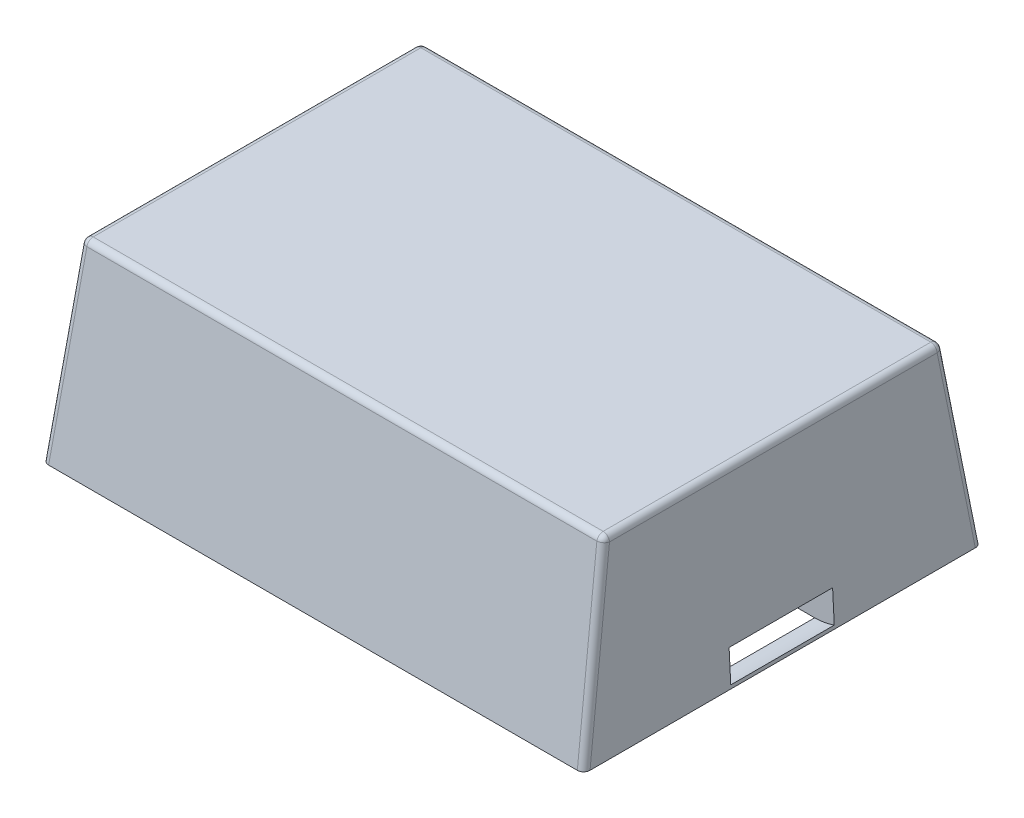
ISO-10303-21;
HEADER;
FILE_DESCRIPTION(('STEP AP214'),'2;1');
FILE_NAME('part.step','',(''),(''),'','','');
FILE_SCHEMA(('AUTOMOTIVE_DESIGN { 1 0 10303 214 1 1 1 1 }'));
ENDSEC;
DATA;
#1=APPLICATION_CONTEXT('core data for automotive mechanical design processes');
#2=APPLICATION_PROTOCOL_DEFINITION('international standard','automotive_design',2000,#1);
#3=PRODUCT_CONTEXT('',#1,'mechanical');
#4=PRODUCT('Part','Part','',(#3));
#5=PRODUCT_RELATED_PRODUCT_CATEGORY('part','',(#4));
#6=PRODUCT_DEFINITION_FORMATION('','',#4);
#7=PRODUCT_DEFINITION_CONTEXT('part definition',#1,'design');
#8=PRODUCT_DEFINITION('design','',#6,#7);
#9=PRODUCT_DEFINITION_SHAPE('','',#8);
#10=(LENGTH_UNIT() NAMED_UNIT(*) SI_UNIT(.MILLI.,.METRE.));
#11=(NAMED_UNIT(*) PLANE_ANGLE_UNIT() SI_UNIT($,.RADIAN.));
#12=(NAMED_UNIT(*) SI_UNIT($,.STERADIAN.) SOLID_ANGLE_UNIT());
#13=UNCERTAINTY_MEASURE_WITH_UNIT(LENGTH_MEASURE(1.E-05),#10,'distance_accuracy_value','');
#14=(GEOMETRIC_REPRESENTATION_CONTEXT(3) GLOBAL_UNCERTAINTY_ASSIGNED_CONTEXT((#13)) GLOBAL_UNIT_ASSIGNED_CONTEXT((#10,
#11,#12)) REPRESENTATION_CONTEXT('',''));
#15=CARTESIAN_POINT('',(0.,0.,0.));
#16=DIRECTION('',(0.,0.,1.));
#17=DIRECTION('',(1.,0.,0.));
#18=AXIS2_PLACEMENT_3D('',#15,#16,#17);
#19=CARTESIAN_POINT('',(0.,0.58,0.));
#20=DIRECTION('',(0.,-1.,0.));
#21=DIRECTION('',(0.,0.,-1.));
#22=AXIS2_PLACEMENT_3D('',#19,#20,#21);
#23=PLANE('',#22);
#24=DIRECTION('',(0.,0.,1.));
#25=VECTOR('',#24,1.);
#26=CARTESIAN_POINT('',(1.650624196682,0.58,0.));
#27=LINE('',#26,#25);
#28=CARTESIAN_POINT('',(1.650624196682,0.58,-1.139435416133));
#29=VERTEX_POINT('',#28);
#30=CARTESIAN_POINT('',(1.650624196682,0.58,-0.110564583867));
#31=VERTEX_POINT('',#30);
#32=EDGE_CURVE('E287',#29,#31,#27,.T.);
#33=ORIENTED_EDGE('',*,*,#32,.F.);
#34=DIRECTION('',(1.,0.,0.));
#35=VECTOR('',#34,1.);
#36=CARTESIAN_POINT('',(0.,0.58,-1.139435416133));
#37=LINE('',#36,#35);
#38=CARTESIAN_POINT('',(0.04937580331846,0.58,-1.139435416133));
#39=VERTEX_POINT('',#38);
#40=EDGE_CURVE('E364',#39,#29,#37,.T.);
#41=ORIENTED_EDGE('',*,*,#40,.F.);
#42=DIRECTION('',(0.,0.,-1.));
#43=VECTOR('',#42,1.);
#44=CARTESIAN_POINT('',(0.04937580331846,0.58,0.));
#45=LINE('',#44,#43);
#46=CARTESIAN_POINT('',(0.04937580331846,0.58,-0.110564583867));
#47=VERTEX_POINT('',#46);
#48=EDGE_CURVE('E192',#47,#39,#45,.T.);
#49=ORIENTED_EDGE('',*,*,#48,.F.);
#50=DIRECTION('',(1.,0.,0.));
#51=VECTOR('',#50,1.);
#52=CARTESIAN_POINT('',(1.7,0.58,-0.110564583867));
#53=LINE('',#52,#51);
#54=EDGE_CURVE('E357',#31,#47,#53,.F.);
#55=ORIENTED_EDGE('',*,*,#54,.F.);
#56=EDGE_LOOP('',(#33,#41,#49,#55));
#57=FACE_BOUND('',#56,.T.);
#58=ADVANCED_FACE('F17',(#57),#23,.F.);
#59=CARTESIAN_POINT('',(0.04937580331846,0.56,-1.139435416133));
#60=DIRECTION('',(1.,0.,0.));
#61=DIRECTION('',(0.,0.,-1.));
#62=AXIS2_PLACEMENT_3D('',#59,#60,#61);
#63=SPHERICAL_SURFACE('',#62,0.02);
#64=CARTESIAN_POINT('',(0.04937580331846,0.56,-1.139435416133));
#65=DIRECTION('',(0.,0.,-1.));
#66=DIRECTION('',(-1.,0.,0.));
#67=AXIS2_PLACEMENT_3D('',#64,#65,#66);
#68=CIRCLE('',#67,0.02);
#69=CARTESIAN_POINT('',(0.0294032126233718,0.561046719125,-1.139435416133));
#70=VERTEX_POINT('',#69);
#71=EDGE_CURVE('E184',#39,#70,#68,.F.);
#72=ORIENTED_EDGE('',*,*,#71,.F.);
#73=CARTESIAN_POINT('',(0.04937580331846,0.56,-1.139435416133));
#74=DIRECTION('',(1.,0.,0.));
#75=DIRECTION('',(0.,0.,-1.));
#76=AXIS2_PLACEMENT_3D('',#73,#74,#75);
#77=CIRCLE('',#76,0.02);
#78=CARTESIAN_POINT('',(0.0493758033184768,0.563184085911291,-1.15918032932377));
#79=VERTEX_POINT('',#78);
#80=EDGE_CURVE('E186',#79,#39,#77,.T.);
#81=ORIENTED_EDGE('',*,*,#80,.F.);
#82=CARTESIAN_POINT('',(0.0493758033184716,0.560000000000125,-1.1394354161329));
#83=DIRECTION('',(0.0516702392480006,0.985926897778821,0.158991630635971));
#84=DIRECTION('',(0.,-0.159204295573432,0.987245659535137));
#85=AXIS2_PLACEMENT_3D('',#82,#83,#84);
#86=CIRCLE('',#85,0.02);
#87=EDGE_CURVE('E20',#70,#79,#86,.F.);
#88=ORIENTED_EDGE('',*,*,#87,.F.);
#89=EDGE_LOOP('',(#72,#81,#88));
#90=FACE_BOUND('',#89,.T.);
#91=ADVANCED_FACE('F183',(#90),#63,.T.);
#92=CARTESIAN_POINT('',(0.003567106827442,0.156322923666,-1.2045328151));
#93=DIRECTION('',(0.904210336759122,-0.421640204614057,-0.0679941523292292));
#94=DIRECTION('',(0.422618261741002,0.906307787036509,0.));
#95=AXIS2_PLACEMENT_3D('',#92,#93,#94);
#96=CYLINDRICAL_SURFACE('',#95,0.02);
#97=CARTESIAN_POINT('',(0.0276318855562741,0.145101333052901,-1.20634242085651));
#98=DIRECTION('',(0.858265018656055,0.506661126287821,0.0817047174897378));
#99=DIRECTION('',(0.513206739775815,-0.847318414399055,-0.136639477710327));
#100=AXIS2_PLACEMENT_3D('',#97,#98,#99);
#101=ELLIPSE('',#100,0.0359151567758046,0.02);
#102=CARTESIAN_POINT('',(0.0276318855559927,0.148285418964822,-1.22608733404701));
#103=VERTEX_POINT('',#102);
#104=CARTESIAN_POINT('',(0.00939286155883296,0.175673887999902,-1.20433530115014));
#105=VERTEX_POINT('',#104);
#106=EDGE_CURVE('E191',#103,#105,#101,.T.);
#107=ORIENTED_EDGE('',*,*,#106,.F.);
#108=DIRECTION('',(0.904210336759015,-0.421640204614275,-0.0679941523293093));
#109=VECTOR('',#108,1.);
#110=CARTESIAN_POINT('',(-0.0499999999999999,0.184485761716962,-1.22024962788777));
#111=LINE('',#110,#109);
#112=CARTESIAN_POINT('',(-0.05,0.184485761716644,-1.22024962788798));
#113=VERTEX_POINT('',#112);
#114=EDGE_CURVE('E446',#113,#103,#111,.T.);
#115=ORIENTED_EDGE('',*,*,#114,.F.);
#116=CARTESIAN_POINT('',(-0.05,0.181301675804865,-1.20050471469748));
#117=DIRECTION('',(1.,0.,0.));
#118=DIRECTION('',(0.,-0.987245659535217,-0.159204295572932));
#119=AXIS2_PLACEMENT_3D('',#116,#117,#118);
#120=ELLIPSE('',#119,0.0221187473610224,0.02);
#121=CARTESIAN_POINT('',(-0.0500000000000298,0.203369234184495,-1.19986911987404));
#122=VERTEX_POINT('',#121);
#123=EDGE_CURVE('E403',#113,#122,#120,.T.);
#124=ORIENTED_EDGE('',*,*,#123,.T.);
#125=DIRECTION('',(-0.904210336759756,0.421640204614121,0.06799415232041));
#126=VECTOR('',#125,1.);
#127=CARTESIAN_POINT('',(0.00939286155909428,0.175673887999934,-1.20433530115));
#128=LINE('',#127,#126);
#129=EDGE_CURVE('E414',#122,#105,#128,.F.);
#130=ORIENTED_EDGE('',*,*,#129,.T.);
#131=EDGE_LOOP('',(#107,#115,#124,#130));
#132=FACE_BOUND('',#131,.T.);
#133=ADVANCED_FACE('F343',(#132),#96,.T.);
#134=CARTESIAN_POINT('',(0.,0.56,-1.139435416133));
#135=DIRECTION('',(1.,0.,0.));
#136=DIRECTION('',(0.,0.,-1.));
#137=AXIS2_PLACEMENT_3D('',#134,#135,#136);
#138=CYLINDRICAL_SURFACE('',#137,0.02);
#139=CARTESIAN_POINT('',(1.650624196682,0.56,-1.139435416133));
#140=DIRECTION('',(1.,0.,0.));
#141=DIRECTION('',(0.,0.,-1.));
#142=AXIS2_PLACEMENT_3D('',#139,#140,#141);
#143=CIRCLE('',#142,0.0200000000000001);
#144=CARTESIAN_POINT('',(1.65062419668184,0.563184085910978,-1.15918032932386));
#145=VERTEX_POINT('',#144);
#146=EDGE_CURVE('E298',#145,#29,#143,.T.);
#147=ORIENTED_EDGE('',*,*,#146,.F.);
#148=DIRECTION('',(1.,0.,0.));
#149=VECTOR('',#148,1.);
#150=CARTESIAN_POINT('',(1.7,0.56318408591099,-1.15918032932394));
#151=LINE('',#150,#149);
#152=EDGE_CURVE('E398',#79,#145,#151,.T.);
#153=ORIENTED_EDGE('',*,*,#152,.F.);
#154=ORIENTED_EDGE('',*,*,#80,.T.);
#155=ORIENTED_EDGE('',*,*,#40,.T.);
#156=EDGE_LOOP('',(#147,#153,#154,#155));
#157=FACE_BOUND('',#156,.T.);
#158=ADVANCED_FACE('F339',(#157),#138,.T.);
#159=CARTESIAN_POINT('',(1.650624196682,0.56,-1.139435416133));
#160=DIRECTION('',(1.,0.,0.));
#161=DIRECTION('',(0.,0.,-1.));
#162=AXIS2_PLACEMENT_3D('',#159,#160,#161);
#163=SPHERICAL_SURFACE('',#162,0.02);
#164=ORIENTED_EDGE('',*,*,#146,.T.);
#165=CARTESIAN_POINT('',(1.650624196682,0.56,-1.139435416133));
#166=DIRECTION('',(0.,0.,1.));
#167=DIRECTION('',(1.,0.,0.));
#168=AXIS2_PLACEMENT_3D('',#165,#166,#167);
#169=CIRCLE('',#168,0.02);
#170=CARTESIAN_POINT('',(1.67059678737688,0.561046719124671,-1.13943541613305));
#171=VERTEX_POINT('',#170);
#172=EDGE_CURVE('E295',#171,#29,#169,.T.);
#173=ORIENTED_EDGE('',*,*,#172,.F.);
#174=CARTESIAN_POINT('',(1.65062419668168,0.559999999999499,-1.1394354161332));
#175=DIRECTION('',(0.0516702392480006,-0.985926897778821,-0.158991630635971));
#176=DIRECTION('',(0.,0.159204295573432,-0.987245659535137));
#177=AXIS2_PLACEMENT_3D('',#174,#175,#176);
#178=CIRCLE('',#177,0.02);
#179=EDGE_CURVE('E305',#145,#171,#178,.T.);
#180=ORIENTED_EDGE('',*,*,#179,.F.);
#181=EDGE_LOOP('',(#164,#173,#180));
#182=FACE_BOUND('',#181,.T.);
#183=ADVANCED_FACE('F335',(#182),#163,.T.);
#184=CARTESIAN_POINT('',(1.694235144279,0.11,-0.4625));
#185=DIRECTION('',(0.,-1.,0.));
#186=DIRECTION('',(0.,0.,-1.));
#187=AXIS2_PLACEMENT_3D('',#184,#185,#186);
#188=PLANE('',#187);
#189=DIRECTION('',(1.,0.,0.));
#190=VECTOR('',#189,1.);
#191=CARTESIAN_POINT('',(1.924235144279,0.11,-0.462499999999998));
#192=LINE('',#191,#190);
#193=CARTESIAN_POINT('',(1.69423514427891,0.109999999999995,-0.4625));
#194=VERTEX_POINT('',#193);
#195=CARTESIAN_POINT('',(1.50230211742,0.11,-0.4625));
#196=VERTEX_POINT('',#195);
#197=EDGE_CURVE('E326',#194,#196,#192,.F.);
#198=ORIENTED_EDGE('',*,*,#197,.T.);
#199=DIRECTION('',(0.,0.,-1.));
#200=VECTOR('',#199,1.);
#201=CARTESIAN_POINT('',(1.50230211742,0.11,-0.4625));
#202=LINE('',#201,#200);
#203=CARTESIAN_POINT('',(1.50230211742,0.11,-0.7875));
#204=VERTEX_POINT('',#203);
#205=EDGE_CURVE('E475',#204,#196,#202,.F.);
#206=ORIENTED_EDGE('',*,*,#205,.F.);
#207=DIRECTION('',(1.,0.,0.));
#208=VECTOR('',#207,1.);
#209=CARTESIAN_POINT('',(1.924235144279,0.11,-0.787499999999998));
#210=LINE('',#209,#208);
#211=CARTESIAN_POINT('',(1.69423514427887,0.109999999999995,-0.7875));
#212=VERTEX_POINT('',#211);
#213=EDGE_CURVE('E312',#212,#204,#210,.F.);
#214=ORIENTED_EDGE('',*,*,#213,.F.);
#215=DIRECTION('',(0.,0.,1.));
#216=VECTOR('',#215,1.);
#217=CARTESIAN_POINT('',(1.69423514427887,0.109999999999993,0.));
#218=LINE('',#217,#216);
#219=EDGE_CURVE('E309',#194,#212,#218,.F.);
#220=ORIENTED_EDGE('',*,*,#219,.F.);
#221=EDGE_LOOP('',(#198,#206,#214,#220));
#222=FACE_BOUND('',#221,.T.);
#223=ADVANCED_FACE('F338',(#222),#188,.T.);
#224=CARTESIAN_POINT('',(1.650624196682,0.56,0.));
#225=DIRECTION('',(0.,0.,1.));
#226=DIRECTION('',(1.,0.,0.));
#227=AXIS2_PLACEMENT_3D('',#224,#225,#226);
#228=CYLINDRICAL_SURFACE('',#227,0.02);
#229=ORIENTED_EDGE('',*,*,#172,.T.);
#230=ORIENTED_EDGE('',*,*,#32,.T.);
#231=CARTESIAN_POINT('',(1.650624196682,0.56,-0.110564583867));
#232=DIRECTION('',(0.,0.,1.));
#233=DIRECTION('',(1.,0.,0.));
#234=AXIS2_PLACEMENT_3D('',#231,#232,#233);
#235=CIRCLE('',#234,0.02);
#236=CARTESIAN_POINT('',(1.67059678737686,0.561046719124993,-0.110564583867));
#237=VERTEX_POINT('',#236);
#238=EDGE_CURVE('E283',#237,#31,#235,.T.);
#239=ORIENTED_EDGE('',*,*,#238,.F.);
#240=DIRECTION('',(0.,0.,1.));
#241=VECTOR('',#240,1.);
#242=CARTESIAN_POINT('',(1.67059678737664,0.561046719124981,0.));
#243=LINE('',#242,#241);
#244=EDGE_CURVE('E290',#171,#237,#243,.T.);
#245=ORIENTED_EDGE('',*,*,#244,.F.);
#246=EDGE_LOOP('',(#229,#230,#239,#245));
#247=FACE_BOUND('',#246,.T.);
#248=ADVANCED_FACE('F275',(#247),#228,.T.);
#249=CARTESIAN_POINT('',(1.650624196682,0.56,-0.110564583867));
#250=DIRECTION('',(1.,0.,0.));
#251=DIRECTION('',(0.,0.,-1.));
#252=AXIS2_PLACEMENT_3D('',#249,#250,#251);
#253=SPHERICAL_SURFACE('',#252,0.02);
#254=CARTESIAN_POINT('',(1.65062419668165,0.560000000000143,-0.110564583866901));
#255=DIRECTION('',(-0.0516702392480006,0.985926897778821,-0.158991630635971));
#256=DIRECTION('',(0.,0.159204295573432,0.987245659535137));
#257=AXIS2_PLACEMENT_3D('',#254,#255,#256);
#258=CIRCLE('',#257,0.02);
#259=CARTESIAN_POINT('',(1.65062419668182,0.563184085911303,-0.0908196706762096));
#260=VERTEX_POINT('',#259);
#261=EDGE_CURVE('E390',#237,#260,#258,.F.);
#262=ORIENTED_EDGE('',*,*,#261,.F.);
#263=ORIENTED_EDGE('',*,*,#238,.T.);
#264=CARTESIAN_POINT('',(1.650624196682,0.56,-0.110564583867));
#265=DIRECTION('',(1.,0.,0.));
#266=DIRECTION('',(0.,0.,-1.));
#267=AXIS2_PLACEMENT_3D('',#264,#265,#266);
#268=CIRCLE('',#267,0.02);
#269=EDGE_CURVE('E286',#260,#31,#268,.F.);
#270=ORIENTED_EDGE('',*,*,#269,.F.);
#271=EDGE_LOOP('',(#262,#263,#270));
#272=FACE_BOUND('',#271,.T.);
#273=ADVANCED_FACE('F270',(#272),#253,.T.);
#274=CARTESIAN_POINT('',(1.7,0.56,-0.110564583867));
#275=DIRECTION('',(1.,0.,0.));
#276=DIRECTION('',(0.,0.,-1.));
#277=AXIS2_PLACEMENT_3D('',#274,#275,#276);
#278=CYLINDRICAL_SURFACE('',#277,0.02);
#279=ORIENTED_EDGE('',*,*,#269,.T.);
#280=ORIENTED_EDGE('',*,*,#54,.T.);
#281=CARTESIAN_POINT('',(0.04937580331846,0.56,-0.110564583867));
#282=DIRECTION('',(1.,0.,0.));
#283=DIRECTION('',(0.,0.,-1.));
#284=AXIS2_PLACEMENT_3D('',#281,#282,#283);
#285=CIRCLE('',#284,0.02);
#286=CARTESIAN_POINT('',(0.0493758033184453,0.563184085910998,-0.0908196706761992));
#287=VERTEX_POINT('',#286);
#288=EDGE_CURVE('E203',#287,#47,#285,.F.);
#289=ORIENTED_EDGE('',*,*,#288,.F.);
#290=DIRECTION('',(1.,0.,0.));
#291=VECTOR('',#290,1.);
#292=CARTESIAN_POINT('',(1.7,0.563184085911012,-0.0908196706761037));
#293=LINE('',#292,#291);
#294=EDGE_CURVE('E389',#260,#287,#293,.F.);
#295=ORIENTED_EDGE('',*,*,#294,.F.);
#296=EDGE_LOOP('',(#279,#280,#289,#295));
#297=FACE_BOUND('',#296,.T.);
#298=ADVANCED_FACE('F265',(#297),#278,.T.);
#299=CARTESIAN_POINT('',(0.04937580331846,0.56,-0.110564583867));
#300=DIRECTION('',(1.,0.,0.));
#301=DIRECTION('',(0.,0.,-1.));
#302=AXIS2_PLACEMENT_3D('',#299,#300,#301);
#303=SPHERICAL_SURFACE('',#302,0.02);
#304=CARTESIAN_POINT('',(0.0493758033184395,0.559999999999514,-0.110564583866997));
#305=DIRECTION('',(-0.0516702392480006,-0.985926897778821,0.158991630635971));
#306=DIRECTION('',(0.,-0.159204295573432,-0.987245659535137));
#307=AXIS2_PLACEMENT_3D('',#304,#305,#306);
#308=CIRCLE('',#307,0.02);
#309=CARTESIAN_POINT('',(0.0294032126233541,0.561046719124686,-0.110564583867));
#310=VERTEX_POINT('',#309);
#311=EDGE_CURVE('E231',#287,#310,#308,.T.);
#312=ORIENTED_EDGE('',*,*,#311,.F.);
#313=ORIENTED_EDGE('',*,*,#288,.T.);
#314=CARTESIAN_POINT('',(0.04937580331846,0.56,-0.110564583867));
#315=DIRECTION('',(0.,0.,-1.));
#316=DIRECTION('',(-1.,0.,0.));
#317=AXIS2_PLACEMENT_3D('',#314,#315,#316);
#318=CIRCLE('',#317,0.02);
#319=EDGE_CURVE('E202',#310,#47,#318,.T.);
#320=ORIENTED_EDGE('',*,*,#319,.F.);
#321=EDGE_LOOP('',(#312,#313,#320));
#322=FACE_BOUND('',#321,.T.);
#323=ADVANCED_FACE('F260',(#322),#303,.T.);
#324=CARTESIAN_POINT('',(0.005764855721132,0.11,-0.7875));
#325=DIRECTION('',(0.,-1.,0.));
#326=DIRECTION('',(0.,0.,-1.));
#327=AXIS2_PLACEMENT_3D('',#324,#325,#326);
#328=PLANE('',#327);
#329=DIRECTION('',(1.,0.,0.));
#330=VECTOR('',#329,1.);
#331=CARTESIAN_POINT('',(-0.224235144279,0.11,-0.787499999999998));
#332=LINE('',#331,#330);
#333=CARTESIAN_POINT('',(0.00576485572113177,0.11,-0.787499999999999));
#334=VERTEX_POINT('',#333);
#335=CARTESIAN_POINT('',(0.19769788258,0.11,-0.787499999999999));
#336=VERTEX_POINT('',#335);
#337=EDGE_CURVE('E251',#334,#336,#332,.T.);
#338=ORIENTED_EDGE('',*,*,#337,.T.);
#339=DIRECTION('',(0.,0.,1.));
#340=VECTOR('',#339,1.);
#341=CARTESIAN_POINT('',(0.19769788258,0.11,-0.7875));
#342=LINE('',#341,#340);
#343=CARTESIAN_POINT('',(0.19769788258,0.11,-0.462499999999999));
#344=VERTEX_POINT('',#343);
#345=EDGE_CURVE('E502',#344,#336,#342,.F.);
#346=ORIENTED_EDGE('',*,*,#345,.F.);
#347=DIRECTION('',(1.,0.,0.));
#348=VECTOR('',#347,1.);
#349=CARTESIAN_POINT('',(-0.224235144279,0.11,-0.462499999999998));
#350=LINE('',#349,#348);
#351=CARTESIAN_POINT('',(0.00576485572113165,0.11,-0.462499999999999));
#352=VERTEX_POINT('',#351);
#353=EDGE_CURVE('E237',#352,#344,#350,.T.);
#354=ORIENTED_EDGE('',*,*,#353,.F.);
#355=DIRECTION('',(0.,0.,1.));
#356=VECTOR('',#355,1.);
#357=CARTESIAN_POINT('',(0.00576485572113165,0.11,0.));
#358=LINE('',#357,#356);
#359=EDGE_CURVE('E234',#334,#352,#358,.T.);
#360=ORIENTED_EDGE('',*,*,#359,.F.);
#361=EDGE_LOOP('',(#338,#346,#354,#360));
#362=FACE_BOUND('',#361,.T.);
#363=ADVANCED_FACE('F264',(#362),#328,.T.);
#364=CARTESIAN_POINT('',(0.04937580331846,0.56,0.));
#365=DIRECTION('',(0.,0.,-1.));
#366=DIRECTION('',(-1.,0.,0.));
#367=AXIS2_PLACEMENT_3D('',#364,#365,#366);
#368=CYLINDRICAL_SURFACE('',#367,0.02);
#369=ORIENTED_EDGE('',*,*,#319,.T.);
#370=ORIENTED_EDGE('',*,*,#48,.T.);
#371=ORIENTED_EDGE('',*,*,#71,.T.);
#372=DIRECTION('',(0.,0.,1.));
#373=VECTOR('',#372,1.);
#374=CARTESIAN_POINT('',(0.0294032126233627,0.561046719125001,0.));
#375=LINE('',#374,#373);
#376=EDGE_CURVE('E199',#310,#70,#375,.F.);
#377=ORIENTED_EDGE('',*,*,#376,.F.);
#378=EDGE_LOOP('',(#369,#370,#371,#377));
#379=FACE_BOUND('',#378,.T.);
#380=ADVANCED_FACE('F197',(#379),#368,.T.);
#381=CARTESIAN_POINT('',(0.05466159413484,0.66085889707,-1.123170802047));
#382=DIRECTION('',(0.0516702392480006,0.985926897778821,0.158991630635971));
#383=DIRECTION('',(0.,-0.159204295573432,0.987245659535137));
#384=AXIS2_PLACEMENT_3D('',#381,#382,#383);
#385=CYLINDRICAL_SURFACE('',#384,0.02);
#386=DIRECTION('',(0.0516702392480959,0.98592689777888,0.158991630635571));
#387=VECTOR('',#386,1.);
#388=CARTESIAN_POINT('',(0.0276318855562899,0.148285418964997,-1.22608733404698));
#389=LINE('',#388,#387);
#390=EDGE_CURVE('E418',#103,#79,#389,.T.);
#391=ORIENTED_EDGE('',*,*,#390,.F.);
#392=ORIENTED_EDGE('',*,*,#106,.T.);
#393=CARTESIAN_POINT('',(0.0287608084982928,0.166642466019443,-1.20286867461427));
#394=DIRECTION('',(-0.422618261740812,-0.906307787036597,0.));
#395=DIRECTION('',(-0.832629915250704,0.388261705890477,0.394943378180496));
#396=AXIS2_PLACEMENT_3D('',#393,#394,#395);
#397=ELLIPSE('',#396,0.0218486106976755,0.02);
#398=CARTESIAN_POINT('',(0.00921111978072266,0.175758635582996,-1.20156738636809));
#399=VERTEX_POINT('',#398);
#400=EDGE_CURVE('E209',#105,#399,#397,.F.);
#401=ORIENTED_EDGE('',*,*,#400,.T.);
#402=DIRECTION('',(-0.051670239247986,-0.985926897778932,-0.158991630635285));
#403=VECTOR('',#402,1.);
#404=CARTESIAN_POINT('',(0.0294032126233627,0.561046719125001,-1.139435416133));
#405=LINE('',#404,#403);
#406=EDGE_CURVE('E206',#70,#399,#405,.T.);
#407=ORIENTED_EDGE('',*,*,#406,.F.);
#408=ORIENTED_EDGE('',*,*,#87,.T.);
#409=EDGE_LOOP('',(#391,#392,#401,#407,#408));
#410=FACE_BOUND('',#409,.T.);
#411=ADVANCED_FACE('F207',(#410),#385,.T.);
#412=CARTESIAN_POINT('',(0.009211119780713,0.175758635583,-1.25));
#413=DIRECTION('',(-0.422618261740812,-0.906307787036597,0.));
#414=DIRECTION('',(0.906307787036597,-0.422618261740812,0.));
#415=AXIS2_PLACEMENT_3D('',#412,#413,#414);
#416=PLANE('',#415);
#417=DIRECTION('',(0.,0.,-1.));
#418=VECTOR('',#417,1.);
#419=CARTESIAN_POINT('',(-0.05,0.203369234185,-1.25));
#420=LINE('',#419,#418);
#421=CARTESIAN_POINT('',(-0.0500000000000664,0.203369234184511,-0.917895186556306));
#422=VERTEX_POINT('',#421);
#423=EDGE_CURVE('E402',#122,#422,#420,.F.);
#424=ORIENTED_EDGE('',*,*,#423,.T.);
#425=DIRECTION('',(-0.905090049263908,0.422050421291957,-0.0518212756571847));
#426=VECTOR('',#425,1.);
#427=CARTESIAN_POINT('',(-0.00652457420968582,0.183096310196719,-0.915405984486533));
#428=LINE('',#427,#426);
#429=CARTESIAN_POINT('',(0.00921111978066979,0.175758635582726,-0.914505031330729));
#430=VERTEX_POINT('',#429);
#431=EDGE_CURVE('E253',#430,#422,#428,.T.);
#432=ORIENTED_EDGE('',*,*,#431,.F.);
#433=DIRECTION('',(0.,0.,1.));
#434=VECTOR('',#433,1.);
#435=CARTESIAN_POINT('',(0.00921111978071772,0.175758635583,0.));
#436=LINE('',#435,#434);
#437=EDGE_CURVE('E212',#399,#430,#436,.T.);
#438=ORIENTED_EDGE('',*,*,#437,.F.);
#439=ORIENTED_EDGE('',*,*,#400,.F.);
#440=ORIENTED_EDGE('',*,*,#129,.F.);
#441=EDGE_LOOP('',(#424,#432,#438,#439,#440));
#442=FACE_BOUND('',#441,.T.);
#443=ADVANCED_FACE('F424',(#442),#416,.F.);
#444=CARTESIAN_POINT('',(-0.01497693944453,0.164970154456,-0.915405984486));
#445=DIRECTION('',(-0.905090049263908,0.422050421291957,-0.0518212756571847));
#446=DIRECTION('',(-0.422618261740956,-0.90630778703653,0.));
#447=AXIS2_PLACEMENT_3D('',#444,#445,#446);
#448=CYLINDRICAL_SURFACE('',#447,0.02);
#449=CARTESIAN_POINT('',(0.00808219683871256,0.154217502616676,-0.914085724851368));
#450=DIRECTION('',(-0.998629534754575,0.0523359562429177,0.));
#451=DIRECTION('',(0.0518409533952964,0.989184317758293,-0.137211154984307));
#452=AXIS2_PLACEMENT_3D('',#449,#450,#451);
#453=ELLIPSE('',#452,0.0215997167723416,0.02);
#454=CARTESIAN_POINT('',(0.00820688765890961,0.156596745200692,-0.894227662598212));
#455=VERTEX_POINT('',#454);
#456=EDGE_CURVE('E380',#430,#455,#453,.F.);
#457=ORIENTED_EDGE('',*,*,#456,.F.);
#458=ORIENTED_EDGE('',*,*,#431,.T.);
#459=CARTESIAN_POINT('',(-0.05,0.181301675805054,-0.917411243163719));
#460=DIRECTION('',(1.,0.,0.));
#461=DIRECTION('',(0.,0.992546151641332,-0.121869343405068));
#462=AXIS2_PLACEMENT_3D('',#459,#460,#461);
#463=ELLIPSE('',#462,0.022097248794488,0.02);
#464=CARTESIAN_POINT('',(-0.05,0.183739062673078,-0.897560320130944));
#465=VERTEX_POINT('',#464);
#466=EDGE_CURVE('E399',#422,#465,#463,.T.);
#467=ORIENTED_EDGE('',*,*,#466,.T.);
#468=DIRECTION('',(-0.905090049268144,0.422050421283009,-0.0518212756560734));
#469=VECTOR('',#468,1.);
#470=CARTESIAN_POINT('',(0.00820688765891701,0.156596745200962,-0.894227662598307));
#471=LINE('',#470,#469);
#472=EDGE_CURVE('E435',#455,#465,#471,.T.);
#473=ORIENTED_EDGE('',*,*,#472,.F.);
#474=EDGE_LOOP('',(#457,#458,#467,#473));
#475=FACE_BOUND('',#474,.T.);
#476=ADVANCED_FACE('F519',(#475),#448,.T.);
#477=CARTESIAN_POINT('',(-0.224235144279,0.46,-0.7875));
#478=DIRECTION('',(0.,0.,-1.));
#479=DIRECTION('',(0.,1.,0.));
#480=AXIS2_PLACEMENT_3D('',#477,#478,#479);
#481=PLANE('',#480);
#482=DIRECTION('',(1.,0.,0.));
#483=VECTOR('',#482,1.);
#484=CARTESIAN_POINT('',(0.,0.,-0.7875));
#485=LINE('',#484,#483);
#486=CARTESIAN_POINT('',(0.19769788258,0.,-0.7875));
#487=VERTEX_POINT('',#486);
#488=CARTESIAN_POINT('',(0.06212335929325,0.,-0.7875));
#489=VERTEX_POINT('',#488);
#490=EDGE_CURVE('E491',#487,#489,#485,.F.);
#491=ORIENTED_EDGE('',*,*,#490,.F.);
#492=DIRECTION('',(0.,1.,0.));
#493=VECTOR('',#492,1.);
#494=CARTESIAN_POINT('',(0.19769788258,0.11,-0.7875));
#495=LINE('',#494,#493);
#496=EDGE_CURVE('E328',#336,#487,#495,.F.);
#497=ORIENTED_EDGE('',*,*,#496,.F.);
#498=ORIENTED_EDGE('',*,*,#337,.F.);
#499=DIRECTION('',(-0.0523359562429177,-0.998629534754575,0.));
#500=VECTOR('',#499,1.);
#501=CARTESIAN_POINT('',(0.,0.,-0.7875));
#502=LINE('',#501,#500);
#503=CARTESIAN_POINT('',(0.000568732015983469,0.0108520533356733,-0.787500000000001));
#504=VERTEX_POINT('',#503);
#505=EDGE_CURVE('E230',#504,#334,#502,.F.);
#506=ORIENTED_EDGE('',*,*,#505,.F.);
#507=CARTESIAN_POINT('',(0.06212335929325,0.18,-0.787500000000001));
#508=DIRECTION('',(0.,0.,1.));
#509=DIRECTION('',(0.,-1.,0.));
#510=AXIS2_PLACEMENT_3D('',#507,#508,#509);
#511=CIRCLE('',#510,0.18);
#512=EDGE_CURVE('E240',#504,#489,#511,.T.);
#513=ORIENTED_EDGE('',*,*,#512,.T.);
#514=EDGE_LOOP('',(#491,#497,#498,#506,#513));
#515=FACE_BOUND('',#514,.T.);
#516=ADVANCED_FACE('F589',(#515),#481,.F.);
#517=CARTESIAN_POINT('',(0.06212335929325,0.18,-0.7875));
#518=DIRECTION('',(0.,0.,1.));
#519=DIRECTION('',(0.,-1.,0.));
#520=AXIS2_PLACEMENT_3D('',#517,#518,#519);
#521=CYLINDRICAL_SURFACE('',#520,0.18);
#522=CARTESIAN_POINT('',(0.06212335929325,0.180000000000002,-0.462500000000001));
#523=DIRECTION('',(0.,0.,1.));
#524=DIRECTION('',(0.,-1.,0.));
#525=AXIS2_PLACEMENT_3D('',#522,#523,#524);
#526=CIRCLE('',#525,0.18);
#527=CARTESIAN_POINT('',(0.06212335929325,0.,-0.4625));
#528=VERTEX_POINT('',#527);
#529=CARTESIAN_POINT('',(0.000568732015983525,0.0108520533356744,-0.462500000000001));
#530=VERTEX_POINT('',#529);
#531=EDGE_CURVE('E239',#528,#530,#526,.F.);
#532=ORIENTED_EDGE('',*,*,#531,.F.);
#533=DIRECTION('',(0.,0.,-1.));
#534=VECTOR('',#533,1.);
#535=CARTESIAN_POINT('',(0.06212335929325,0.,0.));
#536=LINE('',#535,#534);
#537=EDGE_CURVE('E487',#489,#528,#536,.F.);
#538=ORIENTED_EDGE('',*,*,#537,.F.);
#539=ORIENTED_EDGE('',*,*,#512,.F.);
#540=DIRECTION('',(0.,0.,1.));
#541=VECTOR('',#540,1.);
#542=CARTESIAN_POINT('',(0.000568732015983301,0.01085205333567,0.));
#543=LINE('',#542,#541);
#544=EDGE_CURVE('E227',#530,#504,#543,.F.);
#545=ORIENTED_EDGE('',*,*,#544,.F.);
#546=EDGE_LOOP('',(#532,#538,#539,#545));
#547=FACE_BOUND('',#546,.T.);
#548=ADVANCED_FACE('F596',(#547),#521,.F.);
#549=CARTESIAN_POINT('',(-0.224235144279,0.46,-0.4625));
#550=DIRECTION('',(0.,0.,-1.));
#551=DIRECTION('',(0.,1.,0.));
#552=AXIS2_PLACEMENT_3D('',#549,#550,#551);
#553=PLANE('',#552);
#554=DIRECTION('',(1.,0.,0.));
#555=VECTOR('',#554,1.);
#556=CARTESIAN_POINT('',(0.,0.,-0.4625));
#557=LINE('',#556,#555);
#558=CARTESIAN_POINT('',(0.19769788258,0.,-0.4625));
#559=VERTEX_POINT('',#558);
#560=EDGE_CURVE('E490',#528,#559,#557,.T.);
#561=ORIENTED_EDGE('',*,*,#560,.F.);
#562=ORIENTED_EDGE('',*,*,#531,.T.);
#563=DIRECTION('',(-0.0523359562429177,-0.998629534754575,0.));
#564=VECTOR('',#563,1.);
#565=CARTESIAN_POINT('',(0.,0.,-0.4625));
#566=LINE('',#565,#564);
#567=EDGE_CURVE('E218',#352,#530,#566,.T.);
#568=ORIENTED_EDGE('',*,*,#567,.F.);
#569=ORIENTED_EDGE('',*,*,#353,.T.);
#570=DIRECTION('',(0.,1.,0.));
#571=VECTOR('',#570,1.);
#572=CARTESIAN_POINT('',(0.19769788258,0.11,-0.4625));
#573=LINE('',#572,#571);
#574=EDGE_CURVE('E412',#559,#344,#573,.T.);
#575=ORIENTED_EDGE('',*,*,#574,.F.);
#576=EDGE_LOOP('',(#561,#562,#568,#569,#575));
#577=FACE_BOUND('',#576,.T.);
#578=ADVANCED_FACE('F594',(#577),#553,.T.);
#579=CARTESIAN_POINT('',(0.19769788258,0.11,-0.7875));
#580=DIRECTION('',(-1.,0.,0.));
#581=DIRECTION('',(0.,0.,1.));
#582=AXIS2_PLACEMENT_3D('',#579,#580,#581);
#583=PLANE('',#582);
#584=ORIENTED_EDGE('',*,*,#496,.T.);
#585=DIRECTION('',(0.,0.,-1.));
#586=VECTOR('',#585,1.);
#587=CARTESIAN_POINT('',(0.19769788258,0.,0.));
#588=LINE('',#587,#586);
#589=EDGE_CURVE('E480',#559,#487,#588,.T.);
#590=ORIENTED_EDGE('',*,*,#589,.F.);
#591=ORIENTED_EDGE('',*,*,#574,.T.);
#592=ORIENTED_EDGE('',*,*,#345,.T.);
#593=EDGE_LOOP('',(#584,#590,#591,#592));
#594=FACE_BOUND('',#593,.T.);
#595=ADVANCED_FACE('F581',(#594),#583,.T.);
#596=CARTESIAN_POINT('',(1.924235144279,0.46,-0.4625));
#597=DIRECTION('',(0.,0.,1.));
#598=DIRECTION('',(1.,0.,0.));
#599=AXIS2_PLACEMENT_3D('',#596,#597,#598);
#600=PLANE('',#599);
#601=DIRECTION('',(1.,0.,0.));
#602=VECTOR('',#601,1.);
#603=CARTESIAN_POINT('',(0.,0.,-0.4625));
#604=LINE('',#603,#602);
#605=CARTESIAN_POINT('',(1.50230211742,0.,-0.4625));
#606=VERTEX_POINT('',#605);
#607=CARTESIAN_POINT('',(1.637876640707,0.,-0.4625));
#608=VERTEX_POINT('',#607);
#609=EDGE_CURVE('E464',#606,#608,#604,.T.);
#610=ORIENTED_EDGE('',*,*,#609,.F.);
#611=DIRECTION('',(0.,1.,0.));
#612=VECTOR('',#611,1.);
#613=CARTESIAN_POINT('',(1.50230211742,0.11,-0.4625));
#614=LINE('',#613,#612);
#615=EDGE_CURVE('E405',#196,#606,#614,.F.);
#616=ORIENTED_EDGE('',*,*,#615,.F.);
#617=ORIENTED_EDGE('',*,*,#197,.F.);
#618=DIRECTION('',(-0.0523359562429177,0.998629534754575,0.));
#619=VECTOR('',#618,1.);
#620=CARTESIAN_POINT('',(1.7,0.,-0.4625));
#621=LINE('',#620,#619);
#622=CARTESIAN_POINT('',(1.69943126798402,0.0108520533356241,-0.462500000000001));
#623=VERTEX_POINT('',#622);
#624=EDGE_CURVE('E304',#623,#194,#621,.T.);
#625=ORIENTED_EDGE('',*,*,#624,.F.);
#626=CARTESIAN_POINT('',(1.637876640707,0.18,-0.462500000000002));
#627=DIRECTION('',(0.,0.,-1.));
#628=DIRECTION('',(-1.,0.,0.));
#629=AXIS2_PLACEMENT_3D('',#626,#627,#628);
#630=CIRCLE('',#629,0.18);
#631=EDGE_CURVE('E315',#623,#608,#630,.T.);
#632=ORIENTED_EDGE('',*,*,#631,.T.);
#633=EDGE_LOOP('',(#610,#616,#617,#625,#632));
#634=FACE_BOUND('',#633,.T.);
#635=ADVANCED_FACE('F640',(#634),#600,.F.);
#636=CARTESIAN_POINT('',(1.637876640707,0.18,-0.4625));
#637=DIRECTION('',(0.,0.,-1.));
#638=DIRECTION('',(-1.,0.,0.));
#639=AXIS2_PLACEMENT_3D('',#636,#637,#638);
#640=CYLINDRICAL_SURFACE('',#639,0.18);
#641=CARTESIAN_POINT('',(1.637876640707,0.179999999999998,-0.787500000000001));
#642=DIRECTION('',(0.,0.,-1.));
#643=DIRECTION('',(-1.,0.,0.));
#644=AXIS2_PLACEMENT_3D('',#641,#642,#643);
#645=CIRCLE('',#644,0.18);
#646=CARTESIAN_POINT('',(1.637876640707,0.,-0.7875));
#647=VERTEX_POINT('',#646);
#648=CARTESIAN_POINT('',(1.69943126798402,0.0108520533356226,-0.7875));
#649=VERTEX_POINT('',#648);
#650=EDGE_CURVE('E314',#647,#649,#645,.F.);
#651=ORIENTED_EDGE('',*,*,#650,.F.);
#652=DIRECTION('',(0.,0.,-1.));
#653=VECTOR('',#652,1.);
#654=CARTESIAN_POINT('',(1.637876640707,0.,0.));
#655=LINE('',#654,#653);
#656=EDGE_CURVE('E460',#608,#647,#655,.T.);
#657=ORIENTED_EDGE('',*,*,#656,.F.);
#658=ORIENTED_EDGE('',*,*,#631,.F.);
#659=DIRECTION('',(0.,0.,1.));
#660=VECTOR('',#659,1.);
#661=CARTESIAN_POINT('',(1.69943126798402,0.0108520533356609,0.));
#662=LINE('',#661,#660);
#663=EDGE_CURVE('E301',#649,#623,#662,.T.);
#664=ORIENTED_EDGE('',*,*,#663,.F.);
#665=EDGE_LOOP('',(#651,#657,#658,#664));
#666=FACE_BOUND('',#665,.T.);
#667=ADVANCED_FACE('F636',(#666),#640,.F.);
#668=CARTESIAN_POINT('',(1.924235144279,0.46,-0.7875));
#669=DIRECTION('',(0.,0.,1.));
#670=DIRECTION('',(1.,0.,0.));
#671=AXIS2_PLACEMENT_3D('',#668,#669,#670);
#672=PLANE('',#671);
#673=DIRECTION('',(1.,0.,0.));
#674=VECTOR('',#673,1.);
#675=CARTESIAN_POINT('',(0.,0.,-0.7875));
#676=LINE('',#675,#674);
#677=CARTESIAN_POINT('',(1.50230211742,0.,-0.7875));
#678=VERTEX_POINT('',#677);
#679=EDGE_CURVE('E463',#647,#678,#676,.F.);
#680=ORIENTED_EDGE('',*,*,#679,.F.);
#681=ORIENTED_EDGE('',*,*,#650,.T.);
#682=DIRECTION('',(-0.0523359562429177,0.998629534754575,0.));
#683=VECTOR('',#682,1.);
#684=CARTESIAN_POINT('',(1.7,0.,-0.7875));
#685=LINE('',#684,#683);
#686=EDGE_CURVE('E306',#212,#649,#685,.F.);
#687=ORIENTED_EDGE('',*,*,#686,.F.);
#688=ORIENTED_EDGE('',*,*,#213,.T.);
#689=DIRECTION('',(0.,1.,0.));
#690=VECTOR('',#689,1.);
#691=CARTESIAN_POINT('',(1.50230211742,0.11,-0.7875));
#692=LINE('',#691,#690);
#693=EDGE_CURVE('E408',#678,#204,#692,.T.);
#694=ORIENTED_EDGE('',*,*,#693,.F.);
#695=EDGE_LOOP('',(#680,#681,#687,#688,#694));
#696=FACE_BOUND('',#695,.T.);
#697=ADVANCED_FACE('F632',(#696),#672,.T.);
#698=CARTESIAN_POINT('',(1.50230211742,0.11,-0.4625));
#699=DIRECTION('',(1.,0.,0.));
#700=DIRECTION('',(0.,0.,-1.));
#701=AXIS2_PLACEMENT_3D('',#698,#699,#700);
#702=PLANE('',#701);
#703=ORIENTED_EDGE('',*,*,#615,.T.);
#704=DIRECTION('',(0.,0.,-1.));
#705=VECTOR('',#704,1.);
#706=CARTESIAN_POINT('',(1.50230211742,0.,0.));
#707=LINE('',#706,#705);
#708=EDGE_CURVE('E452',#678,#606,#707,.F.);
#709=ORIENTED_EDGE('',*,*,#708,.F.);
#710=ORIENTED_EDGE('',*,*,#693,.T.);
#711=ORIENTED_EDGE('',*,*,#205,.T.);
#712=EDGE_LOOP('',(#703,#709,#710,#711));
#713=FACE_BOUND('',#712,.T.);
#714=ADVANCED_FACE('F629',(#713),#702,.T.);
#715=CARTESIAN_POINT('',(-0.05,0.,-1.25));
#716=DIRECTION('',(1.,0.,0.));
#717=DIRECTION('',(0.,0.,-1.));
#718=AXIS2_PLACEMENT_3D('',#715,#716,#717);
#719=PLANE('',#718);
#720=DIRECTION('',(0.,0.,-1.));
#721=VECTOR('',#720,1.);
#722=CARTESIAN_POINT('',(-0.05,0.,0.));
#723=LINE('',#722,#721);
#724=CARTESIAN_POINT('',(-0.05,0.,-0.875));
#725=VERTEX_POINT('',#724);
#726=CARTESIAN_POINT('',(-0.05,0.,-1.25000000000001));
#727=VERTEX_POINT('',#726);
#728=EDGE_CURVE('E449',#725,#727,#723,.T.);
#729=ORIENTED_EDGE('',*,*,#728,.F.);
#730=DIRECTION('',(0.,-0.992546151641335,0.121869343405041));
#731=VECTOR('',#730,1.);
#732=CARTESIAN_POINT('',(-0.05,0.,-0.875));
#733=LINE('',#732,#731);
#734=EDGE_CURVE('E382',#465,#725,#733,.T.);
#735=ORIENTED_EDGE('',*,*,#734,.F.);
#736=ORIENTED_EDGE('',*,*,#466,.F.);
#737=ORIENTED_EDGE('',*,*,#423,.F.);
#738=ORIENTED_EDGE('',*,*,#123,.F.);
#739=DIRECTION('',(0.,0.987245659535201,0.159204295573032));
#740=VECTOR('',#739,1.);
#741=CARTESIAN_POINT('',(-0.0499999999999999,0.58,-1.156468576954));
#742=LINE('',#741,#740);
#743=EDGE_CURVE('E401',#727,#113,#742,.T.);
#744=ORIENTED_EDGE('',*,*,#743,.F.);
#745=EDGE_LOOP('',(#729,#735,#736,#737,#738,#744));
#746=FACE_BOUND('',#745,.T.);
#747=ADVANCED_FACE('F522',(#746),#719,.F.);
#748=CARTESIAN_POINT('',(1.7,0.58,-1.156468576954));
#749=DIRECTION('',(0.,0.159204295573032,-0.987245659535201));
#750=DIRECTION('',(0.,0.987245659535201,0.159204295573032));
#751=AXIS2_PLACEMENT_3D('',#748,#749,#750);
#752=PLANE('',#751);
#753=DIRECTION('',(0.0516702392480003,-0.985926897778885,-0.158991630635572));
#754=VECTOR('',#753,1.);
#755=CARTESIAN_POINT('',(1.65062419668168,0.563184085910974,-1.15918032932394));
#756=LINE('',#755,#754);
#757=CARTESIAN_POINT('',(1.68013942395182,0.,-1.25000000000013));
#758=VERTEX_POINT('',#757);
#759=EDGE_CURVE('E395',#758,#145,#756,.F.);
#760=ORIENTED_EDGE('',*,*,#759,.F.);
#761=DIRECTION('',(1.,0.,0.));
#762=VECTOR('',#761,1.);
#763=CARTESIAN_POINT('',(0.,0.,-1.25));
#764=LINE('',#763,#762);
#765=EDGE_CURVE('E379',#727,#758,#764,.T.);
#766=ORIENTED_EDGE('',*,*,#765,.F.);
#767=ORIENTED_EDGE('',*,*,#743,.T.);
#768=ORIENTED_EDGE('',*,*,#114,.T.);
#769=ORIENTED_EDGE('',*,*,#390,.T.);
#770=ORIENTED_EDGE('',*,*,#152,.T.);
#771=EDGE_LOOP('',(#760,#766,#767,#768,#769,#770));
#772=FACE_BOUND('',#771,.T.);
#773=ADVANCED_FACE('F566',(#772),#752,.T.);
#774=CARTESIAN_POINT('',(1.649877089026,0.574255663298,-1.137136532556));
#775=DIRECTION('',(0.0516702392480006,-0.985926897778821,-0.158991630635971));
#776=DIRECTION('',(0.,0.159204295573432,-0.987245659535137));
#777=AXIS2_PLACEMENT_3D('',#774,#775,#776);
#778=CYLINDRICAL_SURFACE('',#777,0.02);
#779=ORIENTED_EDGE('',*,*,#179,.T.);
#780=DIRECTION('',(-0.0516702392479864,0.98592689777894,0.158991630635235));
#781=VECTOR('',#780,1.);
#782=CARTESIAN_POINT('',(1.7,0.,-1.229910412745));
#783=LINE('',#782,#781);
#784=CARTESIAN_POINT('',(1.70000000000006,0.,-1.22991041274527));
#785=VERTEX_POINT('',#784);
#786=EDGE_CURVE('E294',#785,#171,#783,.T.);
#787=ORIENTED_EDGE('',*,*,#786,.F.);
#788=CARTESIAN_POINT('',(1.67997255308015,0.,-1.22974161769505));
#789=DIRECTION('',(0.,-1.,0.));
#790=DIRECTION('',(0.309075031616624,0.,-0.951037656894396));
#791=AXIS2_PLACEMENT_3D('',#788,#789,#790);
#792=ELLIPSE('',#791,0.0202854796284163,0.02);
#793=EDGE_CURVE('E376',#758,#785,#792,.T.);
#794=ORIENTED_EDGE('',*,*,#793,.F.);
#795=ORIENTED_EDGE('',*,*,#759,.T.);
#796=EDGE_LOOP('',(#779,#787,#794,#795));
#797=FACE_BOUND('',#796,.T.);
#798=ADVANCED_FACE('F564',(#797),#778,.T.);
#799=CARTESIAN_POINT('',(1.7,0.,0.));
#800=DIRECTION('',(0.998629534754575,0.0523359562429177,0.));
#801=DIRECTION('',(-0.0523359562429177,0.998629534754575,0.));
#802=AXIS2_PLACEMENT_3D('',#799,#800,#801);
#803=PLANE('',#802);
#804=ORIENTED_EDGE('',*,*,#244,.T.);
#805=DIRECTION('',(-0.0516702392480006,0.985926897778821,-0.158991630635971));
#806=VECTOR('',#805,1.);
#807=CARTESIAN_POINT('',(1.66984967972109,0.575302382422821,-0.112863467444235));
#808=LINE('',#807,#806);
#809=CARTESIAN_POINT('',(1.70000000000008,0.,-0.020089587254589));
#810=VERTEX_POINT('',#809);
#811=EDGE_CURVE('E293',#810,#237,#808,.T.);
#812=ORIENTED_EDGE('',*,*,#811,.F.);
#813=DIRECTION('',(0.,0.,-1.));
#814=VECTOR('',#813,1.);
#815=CARTESIAN_POINT('',(1.7,0.,0.));
#816=LINE('',#815,#814);
#817=EDGE_CURVE('E375',#785,#810,#816,.F.);
#818=ORIENTED_EDGE('',*,*,#817,.F.);
#819=ORIENTED_EDGE('',*,*,#786,.T.);
#820=EDGE_LOOP('',(#804,#812,#818,#819));
#821=FACE_BOUND('',#820,.T.);
#822=ORIENTED_EDGE('',*,*,#219,.T.);
#823=ORIENTED_EDGE('',*,*,#686,.T.);
#824=ORIENTED_EDGE('',*,*,#663,.T.);
#825=ORIENTED_EDGE('',*,*,#624,.T.);
#826=EDGE_LOOP('',(#822,#823,#824,#825));
#827=FACE_BOUND('',#826,.T.);
#828=ADVANCED_FACE('F541',(#821,#827),#803,.T.);
#829=CARTESIAN_POINT('',(1.649877089026,0.574255663298,-0.112863467444));
#830=DIRECTION('',(-0.0516702392480006,0.985926897778821,-0.158991630635971));
#831=DIRECTION('',(0.,0.159204295573432,0.987245659535137));
#832=AXIS2_PLACEMENT_3D('',#829,#830,#831);
#833=CYLINDRICAL_SURFACE('',#832,0.02);
#834=ORIENTED_EDGE('',*,*,#261,.T.);
#835=DIRECTION('',(-0.0516702392477552,0.985926897778898,-0.158991630635574));
#836=VECTOR('',#835,1.);
#837=CARTESIAN_POINT('',(1.680139423952,0.,0.));
#838=LINE('',#837,#836);
#839=CARTESIAN_POINT('',(1.68013942395191,0.,1.21686373582459E-13));
#840=VERTEX_POINT('',#839);
#841=EDGE_CURVE('E386',#840,#260,#838,.T.);
#842=ORIENTED_EDGE('',*,*,#841,.F.);
#843=CARTESIAN_POINT('',(1.67997255308015,0.,-0.0202583823049469));
#844=DIRECTION('',(0.,-1.,0.));
#845=DIRECTION('',(-0.309075031616624,0.,-0.951037656894396));
#846=AXIS2_PLACEMENT_3D('',#843,#844,#845);
#847=ELLIPSE('',#846,0.0202854796284163,0.02);
#848=EDGE_CURVE('E372',#810,#840,#847,.T.);
#849=ORIENTED_EDGE('',*,*,#848,.F.);
#850=ORIENTED_EDGE('',*,*,#811,.T.);
#851=EDGE_LOOP('',(#834,#842,#849,#850));
#852=FACE_BOUND('',#851,.T.);
#853=ADVANCED_FACE('F546',(#852),#833,.T.);
#854=CARTESIAN_POINT('',(1.7,0.58,-0.09353142304604));
#855=DIRECTION('',(0.,0.159204295573032,0.987245659535201));
#856=DIRECTION('',(0.,-0.987245659535201,0.159204295573032));
#857=AXIS2_PLACEMENT_3D('',#854,#855,#856);
#858=PLANE('',#857);
#859=ORIENTED_EDGE('',*,*,#294,.T.);
#860=DIRECTION('',(-0.0516702392480006,-0.985926897778821,0.158991630635971));
#861=VECTOR('',#860,1.);
#862=CARTESIAN_POINT('',(0.0546615941348312,0.664042982981469,-0.107084284762297));
#863=LINE('',#862,#861);
#864=CARTESIAN_POINT('',(0.0198605760482943,0.,0.));
#865=VERTEX_POINT('',#864);
#866=EDGE_CURVE('E385',#865,#287,#863,.F.);
#867=ORIENTED_EDGE('',*,*,#866,.F.);
#868=DIRECTION('',(1.,0.,0.));
#869=VECTOR('',#868,1.);
#870=CARTESIAN_POINT('',(0.,0.,0.));
#871=LINE('',#870,#869);
#872=EDGE_CURVE('E371',#840,#865,#871,.F.);
#873=ORIENTED_EDGE('',*,*,#872,.F.);
#874=ORIENTED_EDGE('',*,*,#841,.T.);
#875=EDGE_LOOP('',(#859,#867,#873,#874));
#876=FACE_BOUND('',#875,.T.);
#877=ADVANCED_FACE('F551',(#876),#858,.T.);
#878=CARTESIAN_POINT('',(0.05466159413484,0.66085889707,-0.126829197953));
#879=DIRECTION('',(-0.0516702392480006,-0.985926897778821,0.158991630635971));
#880=DIRECTION('',(0.,-0.159204295573432,-0.987245659535137));
#881=AXIS2_PLACEMENT_3D('',#878,#879,#880);
#882=CYLINDRICAL_SURFACE('',#881,0.02);
#883=ORIENTED_EDGE('',*,*,#311,.T.);
#884=DIRECTION('',(0.0516702392479823,0.985926897778861,-0.158991630635726));
#885=VECTOR('',#884,1.);
#886=CARTESIAN_POINT('',(0.,0.,-0.02008958725471));
#887=LINE('',#886,#885);
#888=CARTESIAN_POINT('',(0.,0.,-0.0200895872546878));
#889=VERTEX_POINT('',#888);
#890=EDGE_CURVE('E216',#889,#310,#887,.T.);
#891=ORIENTED_EDGE('',*,*,#890,.F.);
#892=CARTESIAN_POINT('',(0.020027446919965,0.,-0.0202583823051446));
#893=DIRECTION('',(0.,-1.,0.));
#894=DIRECTION('',(-0.309075031616624,0.,0.951037656894396));
#895=AXIS2_PLACEMENT_3D('',#892,#893,#894);
#896=ELLIPSE('',#895,0.0202854796284163,0.02);
#897=EDGE_CURVE('E368',#865,#889,#896,.T.);
#898=ORIENTED_EDGE('',*,*,#897,.F.);
#899=ORIENTED_EDGE('',*,*,#866,.T.);
#900=EDGE_LOOP('',(#883,#891,#898,#899));
#901=FACE_BOUND('',#900,.T.);
#902=ADVANCED_FACE('F554',(#901),#882,.T.);
#903=CARTESIAN_POINT('',(0.,0.,0.));
#904=DIRECTION('',(-0.998629534754575,0.0523359562429177,0.));
#905=DIRECTION('',(-0.0523359562429177,-0.998629534754575,0.));
#906=AXIS2_PLACEMENT_3D('',#903,#904,#905);
#907=PLANE('',#906);
#908=ORIENTED_EDGE('',*,*,#456,.T.);
#909=DIRECTION('',(0.0519469085924146,0.991206063358919,-0.121704801253714));
#910=VECTOR('',#909,1.);
#911=CARTESIAN_POINT('',(0.,0.,-0.875));
#912=LINE('',#911,#910);
#913=CARTESIAN_POINT('',(0.,0.,-0.875));
#914=VERTEX_POINT('',#913);
#915=EDGE_CURVE('E35',#914,#455,#912,.T.);
#916=ORIENTED_EDGE('',*,*,#915,.F.);
#917=DIRECTION('',(0.,0.,-1.));
#918=VECTOR('',#917,1.);
#919=CARTESIAN_POINT('',(0.,0.,0.));
#920=LINE('',#919,#918);
#921=EDGE_CURVE('E26',#889,#914,#920,.T.);
#922=ORIENTED_EDGE('',*,*,#921,.F.);
#923=ORIENTED_EDGE('',*,*,#890,.T.);
#924=ORIENTED_EDGE('',*,*,#376,.T.);
#925=ORIENTED_EDGE('',*,*,#406,.T.);
#926=ORIENTED_EDGE('',*,*,#437,.T.);
#927=EDGE_LOOP('',(#908,#916,#922,#923,#924,#925,#926));
#928=FACE_BOUND('',#927,.T.);
#929=ORIENTED_EDGE('',*,*,#359,.T.);
#930=ORIENTED_EDGE('',*,*,#567,.T.);
#931=ORIENTED_EDGE('',*,*,#544,.T.);
#932=ORIENTED_EDGE('',*,*,#505,.T.);
#933=EDGE_LOOP('',(#929,#930,#931,#932));
#934=FACE_BOUND('',#933,.T.);
#935=ADVANCED_FACE('F214',(#928,#934),#907,.T.);
#936=CARTESIAN_POINT('',(-0.15,0.,-0.875));
#937=DIRECTION('',(0.,0.121869343405041,0.992546151641335));
#938=DIRECTION('',(0.,-0.992546151641335,0.121869343405041));
#939=AXIS2_PLACEMENT_3D('',#936,#937,#938);
#940=PLANE('',#939);
#941=ORIENTED_EDGE('',*,*,#915,.T.);
#942=ORIENTED_EDGE('',*,*,#472,.T.);
#943=ORIENTED_EDGE('',*,*,#734,.T.);
#944=DIRECTION('',(1.,0.,0.));
#945=VECTOR('',#944,1.);
#946=CARTESIAN_POINT('',(0.,0.,-0.875));
#947=LINE('',#946,#945);
#948=EDGE_CURVE('E11',#914,#725,#947,.F.);
#949=ORIENTED_EDGE('',*,*,#948,.F.);
#950=EDGE_LOOP('',(#941,#942,#943,#949));
#951=FACE_BOUND('',#950,.T.);
#952=ADVANCED_FACE('F516',(#951),#940,.T.);
#953=CARTESIAN_POINT('',(0.,0.,0.));
#954=DIRECTION('',(0.,-1.,0.));
#955=DIRECTION('',(0.,0.,-1.));
#956=AXIS2_PLACEMENT_3D('',#953,#954,#955);
#957=PLANE('',#956);
#958=ORIENTED_EDGE('',*,*,#921,.T.);
#959=ORIENTED_EDGE('',*,*,#948,.T.);
#960=ORIENTED_EDGE('',*,*,#728,.T.);
#961=ORIENTED_EDGE('',*,*,#765,.T.);
#962=ORIENTED_EDGE('',*,*,#793,.T.);
#963=ORIENTED_EDGE('',*,*,#817,.T.);
#964=ORIENTED_EDGE('',*,*,#848,.T.);
#965=ORIENTED_EDGE('',*,*,#872,.T.);
#966=ORIENTED_EDGE('',*,*,#897,.T.);
#967=EDGE_LOOP('',(#958,#959,#960,#961,#962,#963,#964,#965,#966));
#968=FACE_BOUND('',#967,.T.);
#969=ORIENTED_EDGE('',*,*,#679,.T.);
#970=ORIENTED_EDGE('',*,*,#708,.T.);
#971=ORIENTED_EDGE('',*,*,#609,.T.);
#972=ORIENTED_EDGE('',*,*,#656,.T.);
#973=EDGE_LOOP('',(#969,#970,#971,#972));
#974=FACE_BOUND('',#973,.T.);
#975=ORIENTED_EDGE('',*,*,#560,.T.);
#976=ORIENTED_EDGE('',*,*,#589,.T.);
#977=ORIENTED_EDGE('',*,*,#490,.T.);
#978=ORIENTED_EDGE('',*,*,#537,.T.);
#979=EDGE_LOOP('',(#975,#976,#977,#978));
#980=FACE_BOUND('',#979,.T.);
#981=ADVANCED_FACE('F527',(#968,#974,#980),#957,.T.);
#982=CLOSED_SHELL('',(#58,#91,#133,#158,#183,#223,#248,#273,#298,#323,#363,#380,#411,#443,#476,
#516,#548,#578,#595,#635,#667,#697,#714,#747,#773,#798,#828,#853,#877,#902,#935,#952,#981));
#983=MANIFOLD_SOLID_BREP('B1',#982);
#984=ADVANCED_BREP_SHAPE_REPRESENTATION('',(#18,#983),#14);
#985=SHAPE_DEFINITION_REPRESENTATION(#9,#984);
ENDSEC;
END-ISO-10303-21;
